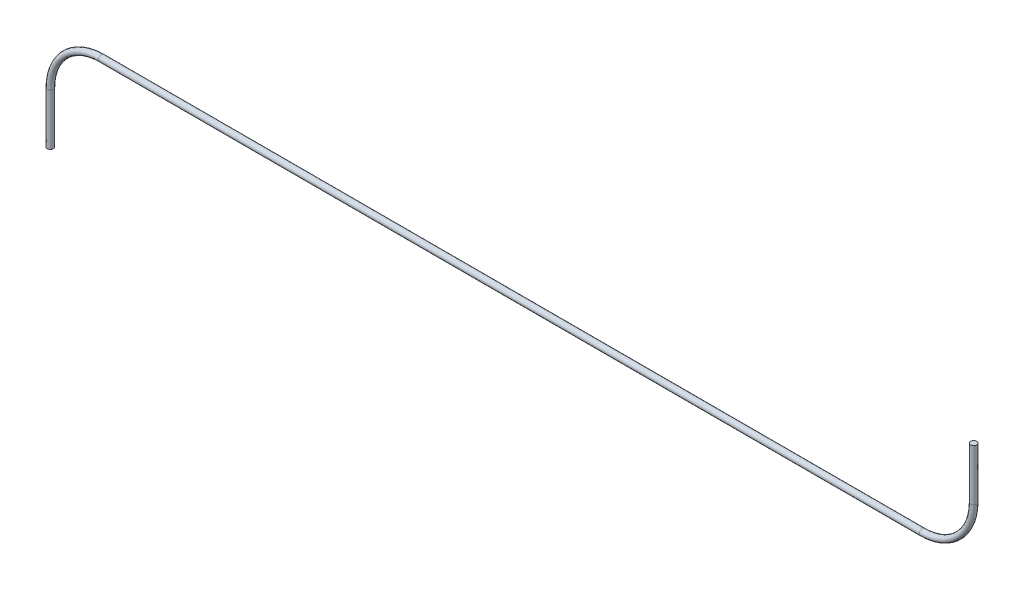
ISO-10303-21;
HEADER;
FILE_DESCRIPTION(('STEP AP214'),'2;1');
FILE_NAME('part.step','',(''),(''),'','','');
FILE_SCHEMA(('AUTOMOTIVE_DESIGN { 1 0 10303 214 1 1 1 1 }'));
ENDSEC;
DATA;
#1=APPLICATION_CONTEXT('core data for automotive mechanical design processes');
#2=APPLICATION_PROTOCOL_DEFINITION('international standard','automotive_design',2000,#1);
#3=PRODUCT_CONTEXT('',#1,'mechanical');
#4=PRODUCT('Part','Part','',(#3));
#5=PRODUCT_RELATED_PRODUCT_CATEGORY('part','',(#4));
#6=PRODUCT_DEFINITION_FORMATION('','',#4);
#7=PRODUCT_DEFINITION_CONTEXT('part definition',#1,'design');
#8=PRODUCT_DEFINITION('design','',#6,#7);
#9=PRODUCT_DEFINITION_SHAPE('','',#8);
#10=(LENGTH_UNIT() NAMED_UNIT(*) SI_UNIT(.MILLI.,.METRE.));
#11=(NAMED_UNIT(*) PLANE_ANGLE_UNIT() SI_UNIT($,.RADIAN.));
#12=(NAMED_UNIT(*) SI_UNIT($,.STERADIAN.) SOLID_ANGLE_UNIT());
#13=UNCERTAINTY_MEASURE_WITH_UNIT(LENGTH_MEASURE(1.E-05),#10,'distance_accuracy_value','');
#14=(GEOMETRIC_REPRESENTATION_CONTEXT(3) GLOBAL_UNCERTAINTY_ASSIGNED_CONTEXT((#13)) GLOBAL_UNIT_ASSIGNED_CONTEXT((#10,
#11,#12)) REPRESENTATION_CONTEXT('',''));
#15=CARTESIAN_POINT('',(0.,0.,0.));
#16=DIRECTION('',(0.,0.,1.));
#17=DIRECTION('',(1.,0.,0.));
#18=AXIS2_PLACEMENT_3D('',#15,#16,#17);
#19=CARTESIAN_POINT('',(0.,0.,0.));
#20=DIRECTION('',(0.,-1.,0.));
#21=DIRECTION('',(0.,0.,-1.));
#22=AXIS2_PLACEMENT_3D('',#19,#20,#21);
#23=PLANE('',#22);
#24=CARTESIAN_POINT('',(0.,0.,0.));
#25=DIRECTION('',(0.,-1.,0.));
#26=DIRECTION('',(0.,0.,-1.));
#27=AXIS2_PLACEMENT_3D('',#24,#25,#26);
#28=CIRCLE('',#27,0.599999999999989);
#29=CARTESIAN_POINT('',(0.,0.,-0.599999999999989));
#30=VERTEX_POINT('',#29);
#31=EDGE_CURVE('E67',#30,#30,#28,.T.);
#32=ORIENTED_EDGE('',*,*,#31,.T.);
#33=EDGE_LOOP('',(#32));
#34=FACE_BOUND('',#33,.T.);
#35=ADVANCED_FACE('F45',(#34),#23,.T.);
#36=CARTESIAN_POINT('',(180.,40.,0.));
#37=DIRECTION('',(0.,-1.,0.));
#38=DIRECTION('',(0.,0.,-1.));
#39=AXIS2_PLACEMENT_3D('',#36,#37,#38);
#40=PLANE('',#39);
#41=CARTESIAN_POINT('',(180.,40.,0.));
#42=DIRECTION('',(0.,-1.,0.));
#43=DIRECTION('',(0.,0.,-1.));
#44=AXIS2_PLACEMENT_3D('',#41,#42,#43);
#45=CIRCLE('',#44,0.599999999999989);
#46=CARTESIAN_POINT('',(180.,40.,-0.599999999999989));
#47=VERTEX_POINT('',#46);
#48=EDGE_CURVE('E11',#47,#47,#45,.T.);
#49=ORIENTED_EDGE('',*,*,#48,.F.);
#50=EDGE_LOOP('',(#49));
#51=FACE_BOUND('',#50,.T.);
#52=ADVANCED_FACE('F75',(#51),#40,.F.);
#53=CARTESIAN_POINT('',(0.,0.,0.));
#54=DIRECTION('',(0.,1.,0.));
#55=DIRECTION('',(0.,0.,1.));
#56=AXIS2_PLACEMENT_3D('',#53,#54,#55);
#57=CYLINDRICAL_SURFACE('',#56,0.599999999999989);
#58=CARTESIAN_POINT('',(0.,9.99999999999993,0.));
#59=DIRECTION('',(0.,-1.,0.));
#60=DIRECTION('',(0.,0.,-1.));
#61=AXIS2_PLACEMENT_3D('',#58,#59,#60);
#62=CIRCLE('',#61,0.599999999999989);
#63=CARTESIAN_POINT('',(-0.599999999999684,9.99999999999992,0.));
#64=VERTEX_POINT('',#63);
#65=EDGE_CURVE('E64',#64,#64,#62,.T.);
#66=ORIENTED_EDGE('',*,*,#65,.T.);
#67=EDGE_LOOP('',(#66));
#68=FACE_BOUND('',#67,.T.);
#69=ORIENTED_EDGE('',*,*,#31,.F.);
#70=EDGE_LOOP('',(#69));
#71=FACE_BOUND('',#70,.T.);
#72=ADVANCED_FACE('F72',(#68,#71),#57,.T.);
#73=CARTESIAN_POINT('',(10.,10.,0.));
#74=DIRECTION('',(0.,0.,-1.));
#75=DIRECTION('',(-1.,0.,0.));
#76=AXIS2_PLACEMENT_3D('',#73,#74,#75);
#77=TOROIDAL_SURFACE('',#76,9.99999999999969,0.599999999999989);
#78=CARTESIAN_POINT('',(10.0000000000001,20.,0.));
#79=DIRECTION('',(-1.,0.,0.));
#80=DIRECTION('',(0.,0.,-1.));
#81=AXIS2_PLACEMENT_3D('',#78,#79,#80);
#82=CIRCLE('',#81,0.599999999999989);
#83=CARTESIAN_POINT('',(10.0000000000001,20.5999999999997,0.));
#84=VERTEX_POINT('',#83);
#85=EDGE_CURVE('E59',#84,#84,#82,.T.);
#86=CARTESIAN_POINT('',(10.,10.,0.));
#87=DIRECTION('',(0.,0.,-1.));
#88=DIRECTION('',(-1.,0.,0.));
#89=AXIS2_PLACEMENT_3D('',#86,#87,#88);
#90=CIRCLE('',#89,10.5999999999997);
#91=EDGE_CURVE('',#64,#84,#90,.T.);
#92=ORIENTED_EDGE('',*,*,#65,.F.);
#93=ORIENTED_EDGE('',*,*,#85,.T.);
#94=ORIENTED_EDGE('',*,*,#91,.T.);
#95=ORIENTED_EDGE('',*,*,#91,.F.);
#96=EDGE_LOOP('',(#92,#94,#93,#95));
#97=FACE_BOUND('',#96,.T.);
#98=ADVANCED_FACE('F74',(#97),#77,.T.);
#99=CARTESIAN_POINT('',(10.0000000000001,20.,0.));
#100=DIRECTION('',(1.,0.,0.));
#101=DIRECTION('',(0.,0.,-1.));
#102=AXIS2_PLACEMENT_3D('',#99,#100,#101);
#103=CYLINDRICAL_SURFACE('',#102,0.599999999999989);
#104=CARTESIAN_POINT('',(170.,20.,0.));
#105=DIRECTION('',(-1.,0.,0.));
#106=DIRECTION('',(0.,0.,-1.));
#107=AXIS2_PLACEMENT_3D('',#104,#105,#106);
#108=CIRCLE('',#107,0.599999999999989);
#109=CARTESIAN_POINT('',(170.,19.4,0.));
#110=VERTEX_POINT('',#109);
#111=EDGE_CURVE('E55',#110,#110,#108,.T.);
#112=ORIENTED_EDGE('',*,*,#111,.T.);
#113=EDGE_LOOP('',(#112));
#114=FACE_BOUND('',#113,.T.);
#115=ORIENTED_EDGE('',*,*,#85,.F.);
#116=EDGE_LOOP('',(#115));
#117=FACE_BOUND('',#116,.T.);
#118=ADVANCED_FACE('F82',(#114,#117),#103,.T.);
#119=CARTESIAN_POINT('',(170.,30.,0.));
#120=DIRECTION('',(0.,0.,1.));
#121=DIRECTION('',(1.,0.,0.));
#122=AXIS2_PLACEMENT_3D('',#119,#120,#121);
#123=TOROIDAL_SURFACE('',#122,10.,0.599999999999989);
#124=CARTESIAN_POINT('',(180.,30.,0.));
#125=DIRECTION('',(0.,-1.,0.));
#126=DIRECTION('',(0.,0.,-1.));
#127=AXIS2_PLACEMENT_3D('',#124,#125,#126);
#128=CIRCLE('',#127,0.599999999999989);
#129=CARTESIAN_POINT('',(180.6,30.,0.));
#130=VERTEX_POINT('',#129);
#131=EDGE_CURVE('E51',#130,#130,#128,.T.);
#132=CARTESIAN_POINT('',(170.,30.,0.));
#133=DIRECTION('',(0.,0.,1.));
#134=DIRECTION('',(1.,0.,0.));
#135=AXIS2_PLACEMENT_3D('',#132,#133,#134);
#136=CIRCLE('',#135,10.6);
#137=EDGE_CURVE('',#110,#130,#136,.T.);
#138=ORIENTED_EDGE('',*,*,#111,.F.);
#139=ORIENTED_EDGE('',*,*,#131,.T.);
#140=ORIENTED_EDGE('',*,*,#137,.T.);
#141=ORIENTED_EDGE('',*,*,#137,.F.);
#142=EDGE_LOOP('',(#138,#140,#139,#141));
#143=FACE_BOUND('',#142,.T.);
#144=ADVANCED_FACE('F88',(#143),#123,.T.);
#145=CARTESIAN_POINT('',(180.,30.,0.));
#146=DIRECTION('',(0.,1.,0.));
#147=DIRECTION('',(0.,0.,1.));
#148=AXIS2_PLACEMENT_3D('',#145,#146,#147);
#149=CYLINDRICAL_SURFACE('',#148,0.599999999999989);
#150=ORIENTED_EDGE('',*,*,#48,.T.);
#151=EDGE_LOOP('',(#150));
#152=FACE_BOUND('',#151,.T.);
#153=ORIENTED_EDGE('',*,*,#131,.F.);
#154=EDGE_LOOP('',(#153));
#155=FACE_BOUND('',#154,.T.);
#156=ADVANCED_FACE('F86',(#152,#155),#149,.T.);
#157=CLOSED_SHELL('',(#35,#52,#72,#98,#118,#144,#156));
#158=MANIFOLD_SOLID_BREP('B2',#157);
#159=ADVANCED_BREP_SHAPE_REPRESENTATION('',(#18,#158),#14);
#160=SHAPE_DEFINITION_REPRESENTATION(#9,#159);
ENDSEC;
END-ISO-10303-21;
